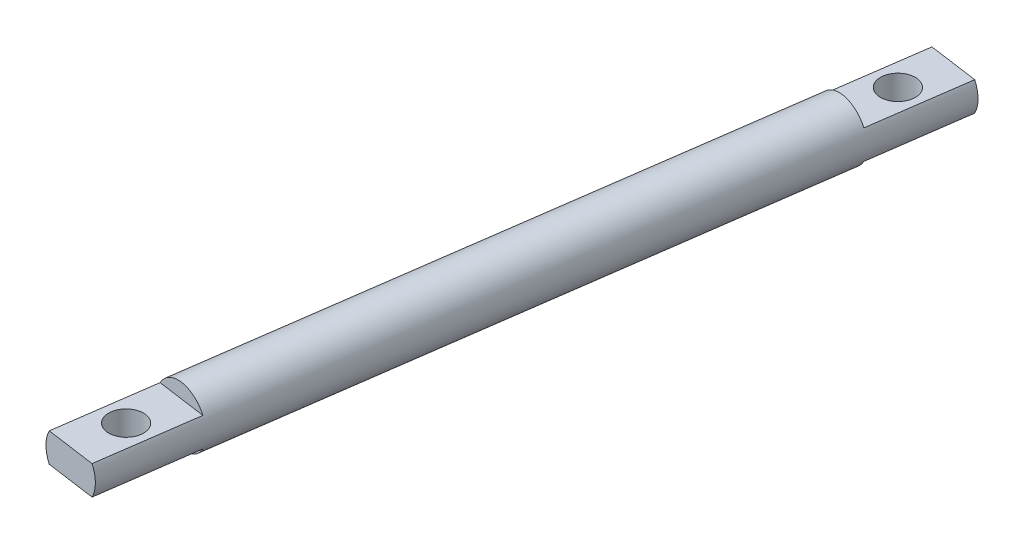
ISO-10303-21;
HEADER;
FILE_DESCRIPTION(('STEP AP214'),'2;1');
FILE_NAME('part.step','',(''),(''),'','','');
FILE_SCHEMA(('AUTOMOTIVE_DESIGN { 1 0 10303 214 1 1 1 1 }'));
ENDSEC;
DATA;
#1=APPLICATION_CONTEXT('core data for automotive mechanical design processes');
#2=APPLICATION_PROTOCOL_DEFINITION('international standard','automotive_design',2000,#1);
#3=PRODUCT_CONTEXT('',#1,'mechanical');
#4=PRODUCT('Part','Part','',(#3));
#5=PRODUCT_RELATED_PRODUCT_CATEGORY('part','',(#4));
#6=PRODUCT_DEFINITION_FORMATION('','',#4);
#7=PRODUCT_DEFINITION_CONTEXT('part definition',#1,'design');
#8=PRODUCT_DEFINITION('design','',#6,#7);
#9=PRODUCT_DEFINITION_SHAPE('','',#8);
#10=(LENGTH_UNIT() NAMED_UNIT(*) SI_UNIT(.MILLI.,.METRE.));
#11=(NAMED_UNIT(*) PLANE_ANGLE_UNIT() SI_UNIT($,.RADIAN.));
#12=(NAMED_UNIT(*) SI_UNIT($,.STERADIAN.) SOLID_ANGLE_UNIT());
#13=UNCERTAINTY_MEASURE_WITH_UNIT(LENGTH_MEASURE(1.E-05),#10,'distance_accuracy_value','');
#14=(GEOMETRIC_REPRESENTATION_CONTEXT(3) GLOBAL_UNCERTAINTY_ASSIGNED_CONTEXT((#13)) GLOBAL_UNIT_ASSIGNED_CONTEXT((#10,
#11,#12)) REPRESENTATION_CONTEXT('',''));
#15=CARTESIAN_POINT('',(0.,0.,0.));
#16=DIRECTION('',(0.,0.,1.));
#17=DIRECTION('',(1.,0.,0.));
#18=AXIS2_PLACEMENT_3D('',#15,#16,#17);
#19=CARTESIAN_POINT('',(-14.1946939134324,-11.1359051601428,-76.0947018411142));
#20=DIRECTION('',(-0.139254831399095,0.,0.990256578838035));
#21=DIRECTION('',(0.990256578838035,0.,0.139254831399095));
#22=AXIS2_PLACEMENT_3D('',#19,#20,#21);
#23=CYLINDRICAL_SURFACE('',#22,3.175);
#24=DIRECTION('',(-0.139254831399095,0.,0.990256578838035));
#25=VECTOR('',#24,1.);
#26=CARTESIAN_POINT('',(-16.9175337609169,-12.7234051601428,-76.4776011946667));
#27=LINE('',#26,#25);
#28=CARTESIAN_POINT('',(-16.0332655815327,-12.7234051601428,-82.765730470288));
#29=VERTEX_POINT('',#28);
#30=CARTESIAN_POINT('',(-14.5388523583732,-12.7234051601428,-93.3926689460885));
#31=VERTEX_POINT('',#30);
#32=EDGE_CURVE('E46',#29,#31,#27,.F.);
#33=ORIENTED_EDGE('',*,*,#32,.F.);
#34=CARTESIAN_POINT('',(-13.3104257340482,-11.1359051601428,-82.3828311167355));
#35=DIRECTION('',(0.139254831399095,0.,-0.990256578838035));
#36=DIRECTION('',(-0.990256578838035,0.,-0.139254831399095));
#37=AXIS2_PLACEMENT_3D('',#34,#35,#36);
#38=CIRCLE('',#37,3.175);
#39=CARTESIAN_POINT('',(-10.5875858865638,-12.7234051601428,-81.999931763183));
#40=VERTEX_POINT('',#39);
#41=EDGE_CURVE('E11',#29,#40,#38,.F.);
#42=ORIENTED_EDGE('',*,*,#41,.T.);
#43=DIRECTION('',(-0.139254831399095,0.,0.990256578838035));
#44=VECTOR('',#43,1.);
#45=CARTESIAN_POINT('',(-11.471854065948,-12.7234051601428,-75.7118024875617));
#46=LINE('',#45,#44);
#47=CARTESIAN_POINT('',(-9.09317266340435,-12.7234051601428,-92.6268702389836));
#48=VERTEX_POINT('',#47);
#49=EDGE_CURVE('E112',#48,#40,#46,.T.);
#50=ORIENTED_EDGE('',*,*,#49,.F.);
#51=CARTESIAN_POINT('',(-11.8160125108888,-11.1359051601428,-93.0097695925361));
#52=DIRECTION('',(-0.139254831399095,0.,0.990256578838035));
#53=DIRECTION('',(0.990256578838035,0.,0.139254831399095));
#54=AXIS2_PLACEMENT_3D('',#51,#52,#53);
#55=CIRCLE('',#54,3.17500000000001);
#56=CARTESIAN_POINT('',(-9.09317266340436,-9.54840516014281,-92.6268702389836));
#57=VERTEX_POINT('',#56);
#58=EDGE_CURVE('E116',#48,#57,#55,.T.);
#59=ORIENTED_EDGE('',*,*,#58,.T.);
#60=DIRECTION('',(-0.139254831399095,0.,0.990256578838035));
#61=VECTOR('',#60,1.);
#62=CARTESIAN_POINT('',(-11.471854065948,-9.54840516014282,-75.7118024875617));
#63=LINE('',#62,#61);
#64=CARTESIAN_POINT('',(-10.5875858865638,-9.54840516014282,-81.999931763183));
#65=VERTEX_POINT('',#64);
#66=EDGE_CURVE('E54',#57,#65,#63,.T.);
#67=ORIENTED_EDGE('',*,*,#66,.T.);
#68=CARTESIAN_POINT('',(-13.3104257340482,-11.1359051601428,-82.3828311167355));
#69=DIRECTION('',(0.139254831399095,0.,-0.990256578838035));
#70=DIRECTION('',(-0.990256578838035,0.,-0.139254831399095));
#71=AXIS2_PLACEMENT_3D('',#68,#69,#70);
#72=CIRCLE('',#71,3.175);
#73=CARTESIAN_POINT('',(-16.0332655815327,-9.54840516014282,-82.765730470288));
#74=VERTEX_POINT('',#73);
#75=EDGE_CURVE('E39',#65,#74,#72,.F.);
#76=ORIENTED_EDGE('',*,*,#75,.T.);
#77=DIRECTION('',(-0.139254831399095,0.,0.990256578838035));
#78=VECTOR('',#77,1.);
#79=CARTESIAN_POINT('',(-16.9175337609169,-9.54840516014282,-76.4776011946667));
#80=LINE('',#79,#78);
#81=CARTESIAN_POINT('',(-14.5388523583732,-9.54840516014281,-93.3926689460886));
#82=VERTEX_POINT('',#81);
#83=EDGE_CURVE('E98',#74,#82,#80,.F.);
#84=ORIENTED_EDGE('',*,*,#83,.T.);
#85=EDGE_CURVE('E111',#82,#31,#55,.T.);
#86=ORIENTED_EDGE('',*,*,#85,.T.);
#87=EDGE_LOOP('',(#33,#42,#50,#59,#67,#76,#84,#86));
#88=FACE_BOUND('',#87,.T.);
#89=CARTESIAN_POINT('',(-23.7171253159759,-11.1359051601428,-8.37963408969213));
#90=DIRECTION('',(-0.139254831399095,0.,0.990256578838035));
#91=DIRECTION('',(0.990256578838035,0.,0.139254831399095));
#92=AXIS2_PLACEMENT_3D('',#89,#90,#91);
#93=CIRCLE('',#92,3.175);
#94=CARTESIAN_POINT('',(-20.9942854684915,-12.7234051601428,-7.99673473613964));
#95=VERTEX_POINT('',#94);
#96=CARTESIAN_POINT('',(-20.9942854684915,-9.54840516014281,-7.99673473613962));
#97=VERTEX_POINT('',#96);
#98=EDGE_CURVE('E122',#95,#97,#93,.T.);
#99=ORIENTED_EDGE('',*,*,#98,.F.);
#100=DIRECTION('',(-0.139254831399095,0.,0.990256578838035));
#101=VECTOR('',#100,1.);
#102=CARTESIAN_POINT('',(-11.471854065948,-12.7234051601428,-75.7118024875617));
#103=LINE('',#102,#101);
#104=CARTESIAN_POINT('',(-19.4998722453321,-12.7234051601428,-18.6236732119402));
#105=VERTEX_POINT('',#104);
#106=EDGE_CURVE('E156',#95,#105,#103,.F.);
#107=ORIENTED_EDGE('',*,*,#106,.T.);
#108=CARTESIAN_POINT('',(-22.2227120928165,-11.1359051601428,-19.0065725654927));
#109=DIRECTION('',(0.139254831399095,0.,-0.990256578838035));
#110=DIRECTION('',(-0.990256578838035,0.,-0.139254831399095));
#111=AXIS2_PLACEMENT_3D('',#108,#109,#110);
#112=CIRCLE('',#111,3.175);
#113=CARTESIAN_POINT('',(-24.9455519403009,-12.7234051601428,-19.3894719190452));
#114=VERTEX_POINT('',#113);
#115=EDGE_CURVE('E105',#114,#105,#112,.F.);
#116=ORIENTED_EDGE('',*,*,#115,.F.);
#117=DIRECTION('',(-0.139254831399095,0.,0.990256578838035));
#118=VECTOR('',#117,1.);
#119=CARTESIAN_POINT('',(-16.9175337609169,-12.7234051601428,-76.4776011946667));
#120=LINE('',#119,#118);
#121=CARTESIAN_POINT('',(-26.4399651634604,-12.7234051601428,-8.7625334432446));
#122=VERTEX_POINT('',#121);
#123=EDGE_CURVE('E154',#114,#122,#120,.T.);
#124=ORIENTED_EDGE('',*,*,#123,.T.);
#125=CARTESIAN_POINT('',(-26.4399651634604,-9.54840516014281,-8.76253344324462));
#126=VERTEX_POINT('',#125);
#127=EDGE_CURVE('E120',#126,#122,#93,.T.);
#128=ORIENTED_EDGE('',*,*,#127,.F.);
#129=DIRECTION('',(-0.139254831399095,0.,0.990256578838035));
#130=VECTOR('',#129,1.);
#131=CARTESIAN_POINT('',(-16.9175337609169,-9.54840516014283,-76.4776011946667));
#132=LINE('',#131,#130);
#133=CARTESIAN_POINT('',(-24.9455519403009,-9.54840516014282,-19.3894719190452));
#134=VERTEX_POINT('',#133);
#135=EDGE_CURVE('E147',#134,#126,#132,.T.);
#136=ORIENTED_EDGE('',*,*,#135,.F.);
#137=CARTESIAN_POINT('',(-22.2227120928165,-11.1359051601428,-19.0065725654927));
#138=DIRECTION('',(0.139254831399095,0.,-0.990256578838035));
#139=DIRECTION('',(-0.990256578838035,0.,-0.139254831399095));
#140=AXIS2_PLACEMENT_3D('',#137,#138,#139);
#141=CIRCLE('',#140,3.175);
#142=CARTESIAN_POINT('',(-19.4998722453321,-9.54840516014282,-18.6236732119402));
#143=VERTEX_POINT('',#142);
#144=EDGE_CURVE('E127',#143,#134,#141,.F.);
#145=ORIENTED_EDGE('',*,*,#144,.F.);
#146=DIRECTION('',(-0.139254831399095,0.,0.990256578838035));
#147=VECTOR('',#146,1.);
#148=CARTESIAN_POINT('',(-11.471854065948,-9.54840516014283,-75.7118024875617));
#149=LINE('',#148,#147);
#150=EDGE_CURVE('E151',#97,#143,#149,.F.);
#151=ORIENTED_EDGE('',*,*,#150,.F.);
#152=EDGE_LOOP('',(#99,#107,#116,#124,#128,#136,#145,#151));
#153=FACE_BOUND('',#152,.T.);
#154=ADVANCED_FACE('F32',(#88,#153),#23,.T.);
#155=CARTESIAN_POINT('',(-8.67194787307804,-11.1359051601428,-92.5676355028439));
#156=DIRECTION('',(0.139254831399095,0.,-0.990256578838035));
#157=DIRECTION('',(-0.990256578838035,0.,-0.139254831399095));
#158=AXIS2_PLACEMENT_3D('',#155,#156,#157);
#159=PLANE('',#158);
#160=DIRECTION('',(0.990256578838035,0.,0.139254831399095));
#161=VECTOR('',#160,1.);
#162=CARTESIAN_POINT('',(-8.67194787307804,-12.7234051601428,-92.5676355028439));
#163=LINE('',#162,#161);
#164=EDGE_CURVE('E104',#31,#48,#163,.T.);
#165=ORIENTED_EDGE('',*,*,#164,.F.);
#166=ORIENTED_EDGE('',*,*,#85,.F.);
#167=DIRECTION('',(0.990256578838035,0.,0.139254831399095));
#168=VECTOR('',#167,1.);
#169=CARTESIAN_POINT('',(-8.67194787307804,-9.54840516014281,-92.5676355028439));
#170=LINE('',#169,#168);
#171=EDGE_CURVE('E95',#82,#57,#170,.T.);
#172=ORIENTED_EDGE('',*,*,#171,.T.);
#173=ORIENTED_EDGE('',*,*,#58,.F.);
#174=EDGE_LOOP('',(#165,#166,#172,#173));
#175=FACE_BOUND('',#174,.T.);
#176=ADVANCED_FACE('F114',(#175),#159,.T.);
#177=CARTESIAN_POINT('',(-20.5730606781652,-11.1359051601428,-7.9375));
#178=DIRECTION('',(-0.139254831399095,0.,0.990256578838035));
#179=DIRECTION('',(0.990256578838035,0.,0.139254831399095));
#180=AXIS2_PLACEMENT_3D('',#177,#178,#179);
#181=PLANE('',#180);
#182=ORIENTED_EDGE('',*,*,#127,.T.);
#183=DIRECTION('',(0.990256578838035,0.,0.139254831399095));
#184=VECTOR('',#183,1.);
#185=CARTESIAN_POINT('',(-20.5730606781652,-12.7234051601428,-7.9375));
#186=LINE('',#185,#184);
#187=EDGE_CURVE('E118',#122,#95,#186,.T.);
#188=ORIENTED_EDGE('',*,*,#187,.T.);
#189=ORIENTED_EDGE('',*,*,#98,.T.);
#190=DIRECTION('',(0.990256578838035,0.,0.139254831399095));
#191=VECTOR('',#190,1.);
#192=CARTESIAN_POINT('',(-20.5730606781652,-9.54840516014281,-7.9375));
#193=LINE('',#192,#191);
#194=EDGE_CURVE('E115',#126,#97,#193,.T.);
#195=ORIENTED_EDGE('',*,*,#194,.F.);
#196=EDGE_LOOP('',(#182,#188,#189,#195));
#197=FACE_BOUND('',#196,.T.);
#198=ADVANCED_FACE('F164',(#197),#181,.T.);
#199=CARTESIAN_POINT('',(-39.2271320497181,-9.54840516014281,-5.51631544449146));
#200=DIRECTION('',(0.,-1.,0.));
#201=DIRECTION('',(0.,0.,-1.));
#202=AXIS2_PLACEMENT_3D('',#199,#200,#201);
#203=PLANE('',#202);
#204=CARTESIAN_POINT('',(-22.9699187043962,-9.54840516014281,-13.6931033275927));
#205=DIRECTION('',(0.,-1.,0.));
#206=DIRECTION('',(0.,0.,-1.));
#207=AXIS2_PLACEMENT_3D('',#204,#205,#206);
#208=CIRCLE('',#207,1.90500000000009);
#209=CARTESIAN_POINT('',(-22.9699187043962,-9.54840516014281,-15.5981033275928));
#210=VERTEX_POINT('',#209);
#211=EDGE_CURVE('E140',#210,#210,#208,.T.);
#212=ORIENTED_EDGE('',*,*,#211,.T.);
#213=EDGE_LOOP('',(#212));
#214=FACE_BOUND('',#213,.T.);
#215=ORIENTED_EDGE('',*,*,#150,.T.);
#216=DIRECTION('',(0.990256578838035,0.,0.139254831399095));
#217=VECTOR('',#216,1.);
#218=CARTESIAN_POINT('',(-37.0371042502914,-9.54840516014282,-21.0898464626376));
#219=LINE('',#218,#217);
#220=EDGE_CURVE('E143',#134,#143,#219,.T.);
#221=ORIENTED_EDGE('',*,*,#220,.F.);
#222=ORIENTED_EDGE('',*,*,#135,.T.);
#223=ORIENTED_EDGE('',*,*,#194,.T.);
#224=EDGE_LOOP('',(#215,#221,#222,#223));
#225=FACE_BOUND('',#224,.T.);
#226=ADVANCED_FACE('F192',(#214,#225),#203,.F.);
#227=CARTESIAN_POINT('',(-37.0371042502914,0.,-21.0898464626376));
#228=DIRECTION('',(0.139254831399095,0.,-0.990256578838035));
#229=DIRECTION('',(-0.990256578838035,0.,-0.139254831399095));
#230=AXIS2_PLACEMENT_3D('',#227,#228,#229);
#231=PLANE('',#230);
#232=ORIENTED_EDGE('',*,*,#220,.T.);
#233=ORIENTED_EDGE('',*,*,#144,.T.);
#234=EDGE_LOOP('',(#232,#233));
#235=FACE_BOUND('',#234,.T.);
#236=ADVANCED_FACE('F181',(#235),#231,.F.);
#237=CARTESIAN_POINT('',(-39.2271320497181,-12.7234051601428,-5.51631544449146));
#238=DIRECTION('',(0.,-1.,0.));
#239=DIRECTION('',(0.,0.,-1.));
#240=AXIS2_PLACEMENT_3D('',#237,#238,#239);
#241=PLANE('',#240);
#242=CARTESIAN_POINT('',(-22.9699187043962,-12.7234051601425,-13.6931033275928));
#243=DIRECTION('',(0.,-1.,0.));
#244=DIRECTION('',(0.,0.,-1.));
#245=AXIS2_PLACEMENT_3D('',#242,#243,#244);
#246=CIRCLE('',#245,1.90500000000009);
#247=CARTESIAN_POINT('',(-22.9699187043962,-12.7234051601424,-15.5981033275929));
#248=VERTEX_POINT('',#247);
#249=EDGE_CURVE('E134',#248,#248,#246,.T.);
#250=ORIENTED_EDGE('',*,*,#249,.F.);
#251=EDGE_LOOP('',(#250));
#252=FACE_BOUND('',#251,.T.);
#253=ORIENTED_EDGE('',*,*,#187,.F.);
#254=ORIENTED_EDGE('',*,*,#123,.F.);
#255=DIRECTION('',(0.990256578838035,0.,0.139254831399095));
#256=VECTOR('',#255,1.);
#257=CARTESIAN_POINT('',(-37.0371042502914,-12.7234051601428,-21.0898464626376));
#258=LINE('',#257,#256);
#259=EDGE_CURVE('E144',#114,#105,#258,.T.);
#260=ORIENTED_EDGE('',*,*,#259,.T.);
#261=ORIENTED_EDGE('',*,*,#106,.F.);
#262=EDGE_LOOP('',(#253,#254,#260,#261));
#263=FACE_BOUND('',#262,.T.);
#264=ADVANCED_FACE('F169',(#252,#263),#241,.T.);
#265=CARTESIAN_POINT('',(-37.0371042502914,0.,-21.0898464626376));
#266=DIRECTION('',(0.139254831399095,0.,-0.990256578838035));
#267=DIRECTION('',(-0.990256578838035,0.,-0.139254831399095));
#268=AXIS2_PLACEMENT_3D('',#265,#266,#267);
#269=PLANE('',#268);
#270=ORIENTED_EDGE('',*,*,#259,.F.);
#271=ORIENTED_EDGE('',*,*,#115,.T.);
#272=EDGE_LOOP('',(#270,#271));
#273=FACE_BOUND('',#272,.T.);
#274=ADVANCED_FACE('F171',(#273),#269,.F.);
#275=CARTESIAN_POINT('',(-22.9699187043962,-7.96090516014259,-13.6931033275927));
#276=DIRECTION('',(0.,-1.,0.));
#277=DIRECTION('',(0.,0.,-1.));
#278=AXIS2_PLACEMENT_3D('',#275,#276,#277);
#279=CYLINDRICAL_SURFACE('',#278,1.90500000000009);
#280=ORIENTED_EDGE('',*,*,#249,.T.);
#281=EDGE_LOOP('',(#280));
#282=FACE_BOUND('',#281,.T.);
#283=ORIENTED_EDGE('',*,*,#211,.F.);
#284=EDGE_LOOP('',(#283));
#285=FACE_BOUND('',#284,.T.);
#286=ADVANCED_FACE('F173',(#282,#285),#279,.F.);
#287=CARTESIAN_POINT('',(-25.9347900920963,-9.54840516014281,-100.039636032026));
#288=DIRECTION('',(0.,1.,0.));
#289=DIRECTION('',(0.,0.,1.));
#290=AXIS2_PLACEMENT_3D('',#287,#288,#289);
#291=PLANE('',#290);
#292=CARTESIAN_POINT('',(-12.5632191224686,-9.54840516014281,-87.6963003546355));
#293=DIRECTION('',(0.,1.,0.));
#294=DIRECTION('',(0.,0.,1.));
#295=AXIS2_PLACEMENT_3D('',#292,#293,#294);
#296=CIRCLE('',#295,1.90500000000009);
#297=CARTESIAN_POINT('',(-12.5632191224686,-9.54840516014281,-85.7913003546354));
#298=VERTEX_POINT('',#297);
#299=EDGE_CURVE('E283',#298,#298,#296,.F.);
#300=ORIENTED_EDGE('',*,*,#299,.T.);
#301=EDGE_LOOP('',(#300));
#302=FACE_BOUND('',#301,.T.);
#303=DIRECTION('',(0.990256578838035,0.,0.139254831399095));
#304=VECTOR('',#303,1.);
#305=CARTESIAN_POINT('',(-28.1248178915231,-9.54840516014282,-84.4661050138804));
#306=LINE('',#305,#304);
#307=EDGE_CURVE('E288',#74,#65,#306,.T.);
#308=ORIENTED_EDGE('',*,*,#307,.T.);
#309=ORIENTED_EDGE('',*,*,#66,.F.);
#310=ORIENTED_EDGE('',*,*,#171,.F.);
#311=ORIENTED_EDGE('',*,*,#83,.F.);
#312=EDGE_LOOP('',(#308,#309,#310,#311));
#313=FACE_BOUND('',#312,.T.);
#314=ADVANCED_FACE('F97',(#302,#313),#291,.T.);
#315=CARTESIAN_POINT('',(-28.1248178915231,0.,-84.4661050138804));
#316=DIRECTION('',(0.139254831399095,0.,-0.990256578838035));
#317=DIRECTION('',(-0.990256578838035,0.,-0.139254831399095));
#318=AXIS2_PLACEMENT_3D('',#315,#316,#317);
#319=PLANE('',#318);
#320=ORIENTED_EDGE('',*,*,#307,.F.);
#321=ORIENTED_EDGE('',*,*,#75,.F.);
#322=EDGE_LOOP('',(#320,#321));
#323=FACE_BOUND('',#322,.T.);
#324=ADVANCED_FACE('F237',(#323),#319,.T.);
#325=CARTESIAN_POINT('',(-28.1248178915231,0.,-84.4661050138804));
#326=DIRECTION('',(0.139254831399095,0.,-0.990256578838035));
#327=DIRECTION('',(-0.990256578838035,0.,-0.139254831399095));
#328=AXIS2_PLACEMENT_3D('',#325,#326,#327);
#329=PLANE('',#328);
#330=DIRECTION('',(0.990256578838035,0.,0.139254831399095));
#331=VECTOR('',#330,1.);
#332=CARTESIAN_POINT('',(-28.1248178915231,-12.7234051601428,-84.4661050138804));
#333=LINE('',#332,#331);
#334=EDGE_CURVE('E291',#29,#40,#333,.T.);
#335=ORIENTED_EDGE('',*,*,#334,.T.);
#336=ORIENTED_EDGE('',*,*,#41,.F.);
#337=EDGE_LOOP('',(#335,#336));
#338=FACE_BOUND('',#337,.T.);
#339=ADVANCED_FACE('F247',(#338),#329,.T.);
#340=CARTESIAN_POINT('',(-25.9347900920963,-12.7234051601428,-100.039636032026));
#341=DIRECTION('',(0.,1.,0.));
#342=DIRECTION('',(0.,0.,1.));
#343=AXIS2_PLACEMENT_3D('',#340,#341,#342);
#344=PLANE('',#343);
#345=CARTESIAN_POINT('',(-12.5632191224686,-12.7234051601425,-87.6963003546354));
#346=DIRECTION('',(0.,1.,0.));
#347=DIRECTION('',(-0.27579602585587,0.,0.961216183864019));
#348=AXIS2_PLACEMENT_3D('',#345,#346,#347);
#349=CIRCLE('',#348,1.90500000000009);
#350=CARTESIAN_POINT('',(-13.0886105517241,-12.7234051601424,-85.8651835243744));
#351=VERTEX_POINT('',#350);
#352=EDGE_CURVE('E286',#351,#351,#349,.T.);
#353=ORIENTED_EDGE('',*,*,#352,.T.);
#354=EDGE_LOOP('',(#353));
#355=FACE_BOUND('',#354,.T.);
#356=ORIENTED_EDGE('',*,*,#32,.T.);
#357=ORIENTED_EDGE('',*,*,#164,.T.);
#358=ORIENTED_EDGE('',*,*,#49,.T.);
#359=ORIENTED_EDGE('',*,*,#334,.F.);
#360=EDGE_LOOP('',(#356,#357,#358,#359));
#361=FACE_BOUND('',#360,.T.);
#362=ADVANCED_FACE('F131',(#355,#361),#344,.F.);
#363=CARTESIAN_POINT('',(-12.5632191224686,-7.96090516014259,-87.6963003546356));
#364=DIRECTION('',(0.,-1.,0.));
#365=DIRECTION('',(0.,0.,-1.));
#366=AXIS2_PLACEMENT_3D('',#363,#364,#365);
#367=CYLINDRICAL_SURFACE('',#366,1.90500000000009);
#368=ORIENTED_EDGE('',*,*,#299,.F.);
#369=EDGE_LOOP('',(#368));
#370=FACE_BOUND('',#369,.T.);
#371=ORIENTED_EDGE('',*,*,#352,.F.);
#372=EDGE_LOOP('',(#371));
#373=FACE_BOUND('',#372,.T.);
#374=ADVANCED_FACE('F266',(#370,#373),#367,.F.);
#375=CLOSED_SHELL('',(#154,#176,#198,#226,#236,#264,#274,#286,#314,#324,#339,#362,#374));
#376=MANIFOLD_SOLID_BREP('B2',#375);
#377=ADVANCED_BREP_SHAPE_REPRESENTATION('',(#18,#376),#14);
#378=SHAPE_DEFINITION_REPRESENTATION(#9,#377);
ENDSEC;
END-ISO-10303-21;
